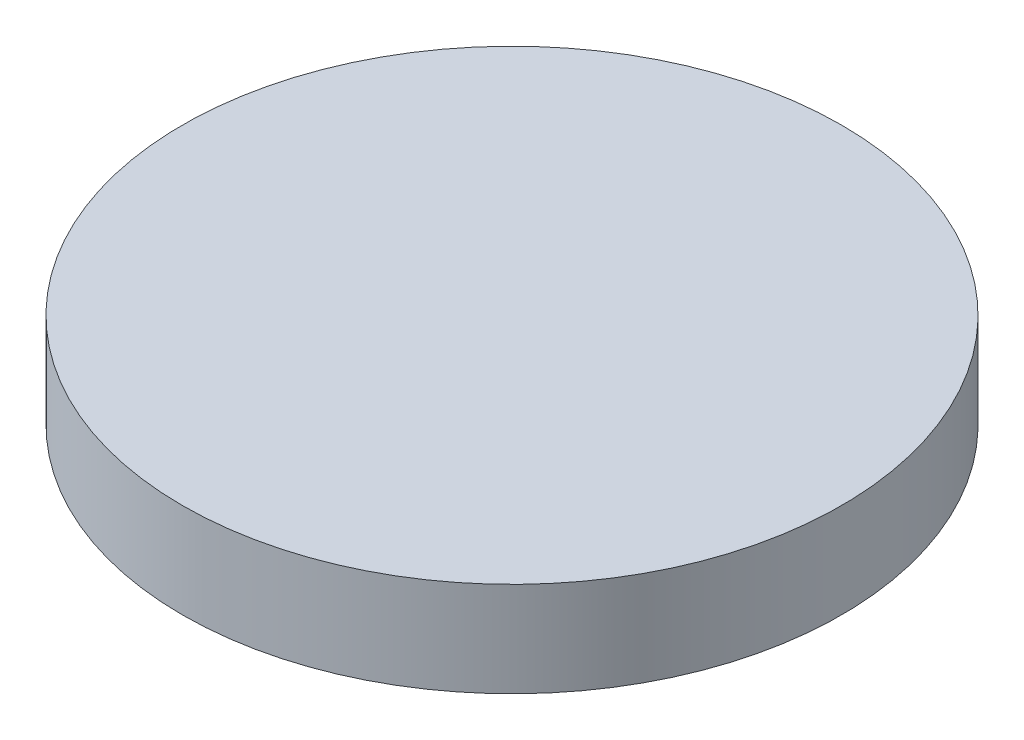
ISO-10303-21;
HEADER;
FILE_DESCRIPTION(('STEP AP214'),'2;1');
FILE_NAME('part.step','',(''),(''),'','','');
FILE_SCHEMA(('AUTOMOTIVE_DESIGN { 1 0 10303 214 1 1 1 1 }'));
ENDSEC;
DATA;
#1=APPLICATION_CONTEXT('core data for automotive mechanical design processes');
#2=APPLICATION_PROTOCOL_DEFINITION('international standard','automotive_design',2000,#1);
#3=PRODUCT_CONTEXT('',#1,'mechanical');
#4=PRODUCT('Part','Part','',(#3));
#5=PRODUCT_RELATED_PRODUCT_CATEGORY('part','',(#4));
#6=PRODUCT_DEFINITION_FORMATION('','',#4);
#7=PRODUCT_DEFINITION_CONTEXT('part definition',#1,'design');
#8=PRODUCT_DEFINITION('design','',#6,#7);
#9=PRODUCT_DEFINITION_SHAPE('','',#8);
#10=(LENGTH_UNIT() NAMED_UNIT(*) SI_UNIT(.MILLI.,.METRE.));
#11=(NAMED_UNIT(*) PLANE_ANGLE_UNIT() SI_UNIT($,.RADIAN.));
#12=(NAMED_UNIT(*) SI_UNIT($,.STERADIAN.) SOLID_ANGLE_UNIT());
#13=UNCERTAINTY_MEASURE_WITH_UNIT(LENGTH_MEASURE(1.E-05),#10,'distance_accuracy_value','');
#14=(GEOMETRIC_REPRESENTATION_CONTEXT(3) GLOBAL_UNCERTAINTY_ASSIGNED_CONTEXT((#13)) GLOBAL_UNIT_ASSIGNED_CONTEXT((#10,
#11,#12)) REPRESENTATION_CONTEXT('',''));
#15=CARTESIAN_POINT('',(0.,0.,0.));
#16=DIRECTION('',(0.,0.,1.));
#17=DIRECTION('',(1.,0.,0.));
#18=AXIS2_PLACEMENT_3D('',#15,#16,#17);
#19=CARTESIAN_POINT('',(0.,-3.22,0.));
#20=DIRECTION('',(0.,1.,0.));
#21=DIRECTION('',(0.,0.,1.));
#22=AXIS2_PLACEMENT_3D('',#19,#20,#21);
#23=CYLINDRICAL_SURFACE('',#22,11.2);
#24=CARTESIAN_POINT('',(0.,-3.22,0.));
#25=DIRECTION('',(0.,1.,0.));
#26=DIRECTION('',(0.,0.,1.));
#27=AXIS2_PLACEMENT_3D('',#24,#25,#26);
#28=CIRCLE('',#27,11.2);
#29=CARTESIAN_POINT('',(0.,-3.22,11.2));
#30=VERTEX_POINT('',#29);
#31=EDGE_CURVE('E10',#30,#30,#28,.T.);
#32=CARTESIAN_POINT('',(0.,0.,0.));
#33=DIRECTION('',(0.,1.,0.));
#34=DIRECTION('',(0.,0.,1.));
#35=AXIS2_PLACEMENT_3D('',#32,#33,#34);
#36=CIRCLE('',#35,11.2);
#37=CARTESIAN_POINT('',(0.,0.,11.2));
#38=VERTEX_POINT('',#37);
#39=EDGE_CURVE('E36',#38,#38,#36,.T.);
#40=CARTESIAN_POINT('',(0.,-3.22,11.2));
#41=CARTESIAN_POINT('',(0.,-3.18645833333333,11.2));
#42=CARTESIAN_POINT('',(0.,-3.15291666666667,11.2));
#43=CARTESIAN_POINT('',(0.,-3.08583333333333,11.2));
#44=CARTESIAN_POINT('',(0.,-3.05229166666667,11.2));
#45=CARTESIAN_POINT('',(0.,-2.98520833333333,11.2));
#46=CARTESIAN_POINT('',(0.,-2.95166666666667,11.2));
#47=CARTESIAN_POINT('',(0.,-2.88458333333333,11.2));
#48=CARTESIAN_POINT('',(0.,-2.85104166666667,11.2));
#49=CARTESIAN_POINT('',(0.,-2.78395833333333,11.2));
#50=CARTESIAN_POINT('',(0.,-2.75041666666667,11.2));
#51=CARTESIAN_POINT('',(0.,-2.68333333333333,11.2));
#52=CARTESIAN_POINT('',(0.,-2.64979166666667,11.2));
#53=CARTESIAN_POINT('',(0.,-2.58270833333333,11.2));
#54=CARTESIAN_POINT('',(0.,-2.54916666666667,11.2));
#55=CARTESIAN_POINT('',(0.,-2.48208333333333,11.2));
#56=CARTESIAN_POINT('',(0.,-2.44854166666667,11.2));
#57=CARTESIAN_POINT('',(0.,-2.38145833333333,11.2));
#58=CARTESIAN_POINT('',(0.,-2.34791666666667,11.2));
#59=CARTESIAN_POINT('',(0.,-2.28083333333333,11.2));
#60=CARTESIAN_POINT('',(0.,-2.24729166666667,11.2));
#61=CARTESIAN_POINT('',(0.,-2.18020833333333,11.2));
#62=CARTESIAN_POINT('',(0.,-2.14666666666667,11.2));
#63=CARTESIAN_POINT('',(0.,-2.07958333333333,11.2));
#64=CARTESIAN_POINT('',(0.,-2.04604166666667,11.2));
#65=CARTESIAN_POINT('',(0.,-1.97895833333333,11.2));
#66=CARTESIAN_POINT('',(0.,-1.94541666666667,11.2));
#67=CARTESIAN_POINT('',(0.,-1.87833333333333,11.2));
#68=CARTESIAN_POINT('',(0.,-1.84479166666667,11.2));
#69=CARTESIAN_POINT('',(0.,-1.77770833333333,11.2));
#70=CARTESIAN_POINT('',(0.,-1.74416666666667,11.2));
#71=CARTESIAN_POINT('',(0.,-1.67708333333333,11.2));
#72=CARTESIAN_POINT('',(0.,-1.64354166666667,11.2));
#73=CARTESIAN_POINT('',(0.,-1.57645833333333,11.2));
#74=CARTESIAN_POINT('',(0.,-1.54291666666667,11.2));
#75=CARTESIAN_POINT('',(0.,-1.47583333333333,11.2));
#76=CARTESIAN_POINT('',(0.,-1.44229166666667,11.2));
#77=CARTESIAN_POINT('',(0.,-1.37520833333333,11.2));
#78=CARTESIAN_POINT('',(0.,-1.34166666666667,11.2));
#79=CARTESIAN_POINT('',(0.,-1.27458333333333,11.2));
#80=CARTESIAN_POINT('',(0.,-1.24104166666667,11.2));
#81=CARTESIAN_POINT('',(0.,-1.17395833333333,11.2));
#82=CARTESIAN_POINT('',(0.,-1.14041666666667,11.2));
#83=CARTESIAN_POINT('',(0.,-1.07333333333333,11.2));
#84=CARTESIAN_POINT('',(0.,-1.03979166666667,11.2));
#85=CARTESIAN_POINT('',(0.,-0.972708333333334,11.2));
#86=CARTESIAN_POINT('',(0.,-0.939166666666667,11.2));
#87=CARTESIAN_POINT('',(0.,-0.872083333333334,11.2));
#88=CARTESIAN_POINT('',(0.,-0.838541666666667,11.2));
#89=CARTESIAN_POINT('',(0.,-0.771458333333333,11.2));
#90=CARTESIAN_POINT('',(0.,-0.737916666666667,11.2));
#91=CARTESIAN_POINT('',(0.,-0.670833333333334,11.2));
#92=CARTESIAN_POINT('',(0.,-0.637291666666667,11.2));
#93=CARTESIAN_POINT('',(0.,-0.570208333333333,11.2));
#94=CARTESIAN_POINT('',(0.,-0.536666666666667,11.2));
#95=CARTESIAN_POINT('',(0.,-0.469583333333333,11.2));
#96=CARTESIAN_POINT('',(0.,-0.436041666666667,11.2));
#97=CARTESIAN_POINT('',(0.,-0.368958333333333,11.2));
#98=CARTESIAN_POINT('',(0.,-0.335416666666667,11.2));
#99=CARTESIAN_POINT('',(0.,-0.268333333333333,11.2));
#100=CARTESIAN_POINT('',(0.,-0.234791666666667,11.2));
#101=CARTESIAN_POINT('',(0.,-0.167708333333333,11.2));
#102=CARTESIAN_POINT('',(0.,-0.134166666666667,11.2));
#103=CARTESIAN_POINT('',(0.,-0.0670833333333334,11.2));
#104=CARTESIAN_POINT('',(0.,-0.0335416666666667,11.2));
#105=CARTESIAN_POINT('',(0.,0.,11.2));
#106=B_SPLINE_CURVE_WITH_KNOTS('',3,(#40,#41,#42,#43,#44,#45,#46,#47,#48,#49,#50,#51,#52,#53,
#54,#55,#56,#57,#58,#59,#60,#61,#62,#63,#64,#65,#66,#67,#68,#69,#70,#71,#72,#73,#74,#75,#76,#77,
#78,#79,#80,#81,#82,#83,#84,#85,#86,#87,#88,#89,#90,#91,#92,#93,#94,#95,#96,#97,#98,#99,#100,
#101,#102,#103,#104,#105),.UNSPECIFIED.,.F.,.F.,(4,2,2,2,2,2,2,2,2,2,2,2,2,2,2,2,2,2,2,2,2,2,2,
2,2,2,2,2,2,2,2,2,4),(0.,0.100625,0.20125,0.301875,0.4025,0.503125,0.60375,0.704375,0.805,
0.905625,1.00625,1.106875,1.2075,1.308125,1.40875,1.509375,1.61,1.710625,1.81125,1.911875,
2.0125,2.113125,2.21375,2.314375,2.415,2.515625,2.61625,2.716875,2.8175,2.918125,3.01875,
3.119375,3.22),.UNSPECIFIED.);
#107=EDGE_CURVE('BSEAM33',#30,#38,#106,.T.);
#108=ORIENTED_EDGE('',*,*,#31,.T.);
#109=ORIENTED_EDGE('',*,*,#39,.F.);
#110=ORIENTED_EDGE('',*,*,#107,.T.);
#111=ORIENTED_EDGE('',*,*,#107,.F.);
#112=EDGE_LOOP('',(#108,#110,#109,#111));
#113=FACE_BOUND('',#112,.T.);
#114=ADVANCED_FACE('F33',(#113),#23,.T.);
#115=CARTESIAN_POINT('',(0.,-3.22,0.));
#116=DIRECTION('',(0.,1.,0.));
#117=DIRECTION('',(0.,0.,1.));
#118=AXIS2_PLACEMENT_3D('',#115,#116,#117);
#119=PLANE('',#118);
#120=ORIENTED_EDGE('',*,*,#31,.F.);
#121=EDGE_LOOP('',(#120));
#122=FACE_BOUND('',#121,.T.);
#123=ADVANCED_FACE('F48',(#122),#119,.F.);
#124=CARTESIAN_POINT('',(0.,0.,0.));
#125=DIRECTION('',(0.,1.,0.));
#126=DIRECTION('',(0.,0.,1.));
#127=AXIS2_PLACEMENT_3D('',#124,#125,#126);
#128=PLANE('',#127);
#129=ORIENTED_EDGE('',*,*,#39,.T.);
#130=EDGE_LOOP('',(#129));
#131=FACE_BOUND('',#130,.T.);
#132=ADVANCED_FACE('F45',(#131),#128,.T.);
#133=CLOSED_SHELL('',(#114,#123,#132));
#134=MANIFOLD_SOLID_BREP('B2',#133);
#135=ADVANCED_BREP_SHAPE_REPRESENTATION('',(#18,#134),#14);
#136=SHAPE_DEFINITION_REPRESENTATION(#9,#135);
ENDSEC;
END-ISO-10303-21;
